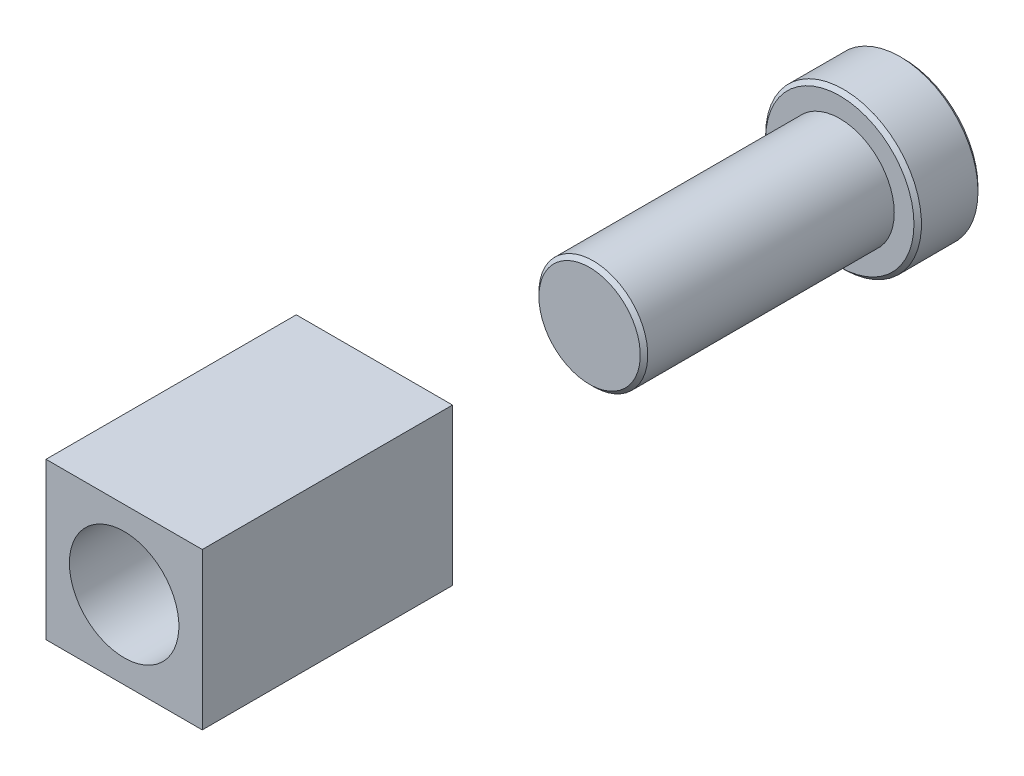
ISO-10303-21;
HEADER;
FILE_DESCRIPTION(('STEP AP214'),'2;1');
FILE_NAME('part.step','',(''),(''),'','','');
FILE_SCHEMA(('AUTOMOTIVE_DESIGN { 1 0 10303 214 1 1 1 1 }'));
ENDSEC;
DATA;
#1=APPLICATION_CONTEXT('core data for automotive mechanical design processes');
#2=APPLICATION_PROTOCOL_DEFINITION('international standard','automotive_design',2000,#1);
#3=PRODUCT_CONTEXT('',#1,'mechanical');
#4=PRODUCT('Part','Part','',(#3));
#5=PRODUCT_RELATED_PRODUCT_CATEGORY('part','',(#4));
#6=PRODUCT_DEFINITION_FORMATION('','',#4);
#7=PRODUCT_DEFINITION_CONTEXT('part definition',#1,'design');
#8=PRODUCT_DEFINITION('design','',#6,#7);
#9=PRODUCT_DEFINITION_SHAPE('','',#8);
#10=(LENGTH_UNIT() NAMED_UNIT(*) SI_UNIT(.MILLI.,.METRE.));
#11=(NAMED_UNIT(*) PLANE_ANGLE_UNIT() SI_UNIT($,.RADIAN.));
#12=(NAMED_UNIT(*) SI_UNIT($,.STERADIAN.) SOLID_ANGLE_UNIT());
#13=UNCERTAINTY_MEASURE_WITH_UNIT(LENGTH_MEASURE(1.E-05),#10,'distance_accuracy_value','');
#14=(GEOMETRIC_REPRESENTATION_CONTEXT(3) GLOBAL_UNCERTAINTY_ASSIGNED_CONTEXT((#13)) GLOBAL_UNIT_ASSIGNED_CONTEXT((#10,
#11,#12)) REPRESENTATION_CONTEXT('',''));
#15=CARTESIAN_POINT('',(0.,0.,0.));
#16=DIRECTION('',(0.,0.,1.));
#17=DIRECTION('',(1.,0.,0.));
#18=AXIS2_PLACEMENT_3D('',#15,#16,#17);
#19=CARTESIAN_POINT('',(-15.8613491960392,15.8613491960392,158.283276511442));
#20=DIRECTION('',(1.,0.,0.));
#21=DIRECTION('',(0.,1.,0.));
#22=AXIS2_PLACEMENT_3D('',#19,#20,#21);
#23=PLANE('',#22);
#24=DIRECTION('',(0.,-1.,0.));
#25=VECTOR('',#24,1.);
#26=CARTESIAN_POINT('',(-15.8613491960392,15.8613491960392,107.483276511442));
#27=LINE('',#26,#25);
#28=CARTESIAN_POINT('',(-15.8613491960392,15.8613491960392,107.483276511442));
#29=VERTEX_POINT('',#28);
#30=CARTESIAN_POINT('',(-15.8613491960392,-15.8613491960392,107.483276511442));
#31=VERTEX_POINT('',#30);
#32=EDGE_CURVE('E108',#29,#31,#27,.T.);
#33=ORIENTED_EDGE('',*,*,#32,.T.);
#34=DIRECTION('',(0.,0.,-1.));
#35=VECTOR('',#34,1.);
#36=CARTESIAN_POINT('',(-15.8613491960392,-15.8613491960392,158.283276511442));
#37=LINE('',#36,#35);
#38=CARTESIAN_POINT('',(-15.8613491960392,-15.8613491960392,158.283276511442));
#39=VERTEX_POINT('',#38);
#40=EDGE_CURVE('E12',#39,#31,#37,.T.);
#41=ORIENTED_EDGE('',*,*,#40,.F.);
#42=DIRECTION('',(0.,-1.,0.));
#43=VECTOR('',#42,1.);
#44=CARTESIAN_POINT('',(-15.8613491960392,15.8613491960392,158.283276511442));
#45=LINE('',#44,#43);
#46=CARTESIAN_POINT('',(-15.8613491960392,15.8613491960392,158.283276511442));
#47=VERTEX_POINT('',#46);
#48=EDGE_CURVE('E96',#47,#39,#45,.T.);
#49=ORIENTED_EDGE('',*,*,#48,.F.);
#50=DIRECTION('',(0.,0.,-1.));
#51=VECTOR('',#50,1.);
#52=CARTESIAN_POINT('',(-15.8613491960392,15.8613491960392,158.283276511442));
#53=LINE('',#52,#51);
#54=EDGE_CURVE('E104',#47,#29,#53,.T.);
#55=ORIENTED_EDGE('',*,*,#54,.T.);
#56=EDGE_LOOP('',(#33,#41,#49,#55));
#57=FACE_BOUND('',#56,.T.);
#58=ADVANCED_FACE('F45',(#57),#23,.F.);
#59=CARTESIAN_POINT('',(-15.8613491960392,-15.8613491960392,158.283276511442));
#60=DIRECTION('',(0.,1.,0.));
#61=DIRECTION('',(0.,0.,1.));
#62=AXIS2_PLACEMENT_3D('',#59,#60,#61);
#63=PLANE('',#62);
#64=DIRECTION('',(1.,0.,0.));
#65=VECTOR('',#64,1.);
#66=CARTESIAN_POINT('',(-15.8613491960392,-15.8613491960392,107.483276511442));
#67=LINE('',#66,#65);
#68=CARTESIAN_POINT('',(15.8613491960392,-15.8613491960392,107.483276511442));
#69=VERTEX_POINT('',#68);
#70=EDGE_CURVE('E100',#31,#69,#67,.T.);
#71=ORIENTED_EDGE('',*,*,#70,.T.);
#72=DIRECTION('',(0.,0.,-1.));
#73=VECTOR('',#72,1.);
#74=CARTESIAN_POINT('',(15.8613491960392,-15.8613491960392,158.283276511442));
#75=LINE('',#74,#73);
#76=CARTESIAN_POINT('',(15.8613491960392,-15.8613491960392,158.283276511442));
#77=VERTEX_POINT('',#76);
#78=EDGE_CURVE('E53',#77,#69,#75,.T.);
#79=ORIENTED_EDGE('',*,*,#78,.F.);
#80=DIRECTION('',(1.,0.,0.));
#81=VECTOR('',#80,1.);
#82=CARTESIAN_POINT('',(-15.8613491960392,-15.8613491960392,158.283276511442));
#83=LINE('',#82,#81);
#84=EDGE_CURVE('E91',#39,#77,#83,.T.);
#85=ORIENTED_EDGE('',*,*,#84,.F.);
#86=ORIENTED_EDGE('',*,*,#40,.T.);
#87=EDGE_LOOP('',(#71,#79,#85,#86));
#88=FACE_BOUND('',#87,.T.);
#89=ADVANCED_FACE('F99',(#88),#63,.F.);
#90=CARTESIAN_POINT('',(15.8613491960392,15.8613491960392,158.283276511442));
#91=DIRECTION('',(-1.,0.,0.));
#92=DIRECTION('',(0.,-1.,0.));
#93=AXIS2_PLACEMENT_3D('',#90,#91,#92);
#94=PLANE('',#93);
#95=DIRECTION('',(0.,1.,0.));
#96=VECTOR('',#95,1.);
#97=CARTESIAN_POINT('',(15.8613491960392,15.8613491960392,107.483276511442));
#98=LINE('',#97,#96);
#99=CARTESIAN_POINT('',(15.8613491960392,15.8613491960392,107.483276511442));
#100=VERTEX_POINT('',#99);
#101=EDGE_CURVE('E78',#69,#100,#98,.T.);
#102=ORIENTED_EDGE('',*,*,#101,.T.);
#103=DIRECTION('',(0.,0.,-1.));
#104=VECTOR('',#103,1.);
#105=CARTESIAN_POINT('',(15.8613491960392,15.8613491960392,158.283276511442));
#106=LINE('',#105,#104);
#107=CARTESIAN_POINT('',(15.8613491960392,15.8613491960392,158.283276511442));
#108=VERTEX_POINT('',#107);
#109=EDGE_CURVE('E101',#108,#100,#106,.T.);
#110=ORIENTED_EDGE('',*,*,#109,.F.);
#111=DIRECTION('',(0.,1.,0.));
#112=VECTOR('',#111,1.);
#113=CARTESIAN_POINT('',(15.8613491960392,15.8613491960392,158.283276511442));
#114=LINE('',#113,#112);
#115=EDGE_CURVE('E94',#77,#108,#114,.T.);
#116=ORIENTED_EDGE('',*,*,#115,.F.);
#117=ORIENTED_EDGE('',*,*,#78,.T.);
#118=EDGE_LOOP('',(#102,#110,#116,#117));
#119=FACE_BOUND('',#118,.T.);
#120=ADVANCED_FACE('F102',(#119),#94,.F.);
#121=CARTESIAN_POINT('',(-15.8613491960392,15.8613491960392,158.283276511442));
#122=DIRECTION('',(0.,-1.,0.));
#123=DIRECTION('',(0.,0.,-1.));
#124=AXIS2_PLACEMENT_3D('',#121,#122,#123);
#125=PLANE('',#124);
#126=DIRECTION('',(-1.,0.,0.));
#127=VECTOR('',#126,1.);
#128=CARTESIAN_POINT('',(-15.8613491960392,15.8613491960392,107.483276511442));
#129=LINE('',#128,#127);
#130=EDGE_CURVE('E84',#100,#29,#129,.T.);
#131=ORIENTED_EDGE('',*,*,#130,.T.);
#132=ORIENTED_EDGE('',*,*,#54,.F.);
#133=DIRECTION('',(-1.,0.,0.));
#134=VECTOR('',#133,1.);
#135=CARTESIAN_POINT('',(-15.8613491960392,15.8613491960392,158.283276511442));
#136=LINE('',#135,#134);
#137=EDGE_CURVE('E61',#108,#47,#136,.T.);
#138=ORIENTED_EDGE('',*,*,#137,.F.);
#139=ORIENTED_EDGE('',*,*,#109,.T.);
#140=EDGE_LOOP('',(#131,#132,#138,#139));
#141=FACE_BOUND('',#140,.T.);
#142=ADVANCED_FACE('F116',(#141),#125,.F.);
#143=CARTESIAN_POINT('',(0.,0.,158.283276511442));
#144=DIRECTION('',(0.,0.,1.));
#145=DIRECTION('',(1.,0.,0.));
#146=AXIS2_PLACEMENT_3D('',#143,#144,#145);
#147=PLANE('',#146);
#148=CARTESIAN_POINT('',(0.,0.,158.283276511442));
#149=DIRECTION('',(0.,0.,-1.));
#150=DIRECTION('',(-1.,0.,0.));
#151=AXIS2_PLACEMENT_3D('',#148,#149,#150);
#152=CIRCLE('',#151,11.1125);
#153=CARTESIAN_POINT('',(-11.1125,0.,158.283276511442));
#154=VERTEX_POINT('',#153);
#155=EDGE_CURVE('E111',#154,#154,#152,.T.);
#156=ORIENTED_EDGE('',*,*,#155,.T.);
#157=EDGE_LOOP('',(#156));
#158=FACE_BOUND('',#157,.T.);
#159=ORIENTED_EDGE('',*,*,#48,.T.);
#160=ORIENTED_EDGE('',*,*,#84,.T.);
#161=ORIENTED_EDGE('',*,*,#115,.T.);
#162=ORIENTED_EDGE('',*,*,#137,.T.);
#163=EDGE_LOOP('',(#159,#160,#161,#162));
#164=FACE_BOUND('',#163,.T.);
#165=ADVANCED_FACE('F92',(#158,#164),#147,.T.);
#166=CARTESIAN_POINT('',(0.,0.,107.483276511442));
#167=DIRECTION('',(0.,0.,1.));
#168=DIRECTION('',(1.,0.,0.));
#169=AXIS2_PLACEMENT_3D('',#166,#167,#168);
#170=PLANE('',#169);
#171=CARTESIAN_POINT('',(0.,0.,107.483276511442));
#172=DIRECTION('',(0.,0.,-1.));
#173=DIRECTION('',(-1.,0.,0.));
#174=AXIS2_PLACEMENT_3D('',#171,#172,#173);
#175=CIRCLE('',#174,11.1125);
#176=CARTESIAN_POINT('',(-11.1125,0.,107.483276511442));
#177=VERTEX_POINT('',#176);
#178=EDGE_CURVE('E122',#177,#177,#175,.T.);
#179=ORIENTED_EDGE('',*,*,#178,.F.);
#180=EDGE_LOOP('',(#179));
#181=FACE_BOUND('',#180,.T.);
#182=ORIENTED_EDGE('',*,*,#32,.F.);
#183=ORIENTED_EDGE('',*,*,#130,.F.);
#184=ORIENTED_EDGE('',*,*,#101,.F.);
#185=ORIENTED_EDGE('',*,*,#70,.F.);
#186=EDGE_LOOP('',(#182,#183,#184,#185));
#187=FACE_BOUND('',#186,.T.);
#188=ADVANCED_FACE('F119',(#181,#187),#170,.F.);
#189=CARTESIAN_POINT('',(0.,0.,158.283276511442));
#190=DIRECTION('',(0.,0.,-1.));
#191=DIRECTION('',(-1.,0.,0.));
#192=AXIS2_PLACEMENT_3D('',#189,#190,#191);
#193=CYLINDRICAL_SURFACE('',#192,11.1125);
#194=ORIENTED_EDGE('',*,*,#155,.F.);
#195=EDGE_LOOP('',(#194));
#196=FACE_BOUND('',#195,.T.);
#197=ORIENTED_EDGE('',*,*,#178,.T.);
#198=EDGE_LOOP('',(#197));
#199=FACE_BOUND('',#198,.T.);
#200=ADVANCED_FACE('F129',(#196,#199),#193,.F.);
#201=CLOSED_SHELL('',(#58,#89,#120,#142,#165,#188,#200));
#202=MANIFOLD_SOLID_BREP('B2',#201);
#203=CARTESIAN_POINT('',(0.,0.,12.9988235294118));
#204=DIRECTION('',(0.,0.,1.));
#205=DIRECTION('',(1.,0.,0.));
#206=AXIS2_PLACEMENT_3D('',#203,#204,#205);
#207=PLANE('',#206);
#208=CARTESIAN_POINT('',(0.,0.,12.9988235294118));
#209=DIRECTION('',(0.,0.,1.));
#210=DIRECTION('',(1.,0.,0.));
#211=AXIS2_PLACEMENT_3D('',#208,#209,#210);
#212=CIRCLE('',#211,15.0495000000001);
#213=CARTESIAN_POINT('',(15.0495000000001,0.,12.9988235294118));
#214=VERTEX_POINT('',#213);
#215=EDGE_CURVE('E201',#214,#214,#212,.T.);
#216=ORIENTED_EDGE('',*,*,#215,.T.);
#217=EDGE_LOOP('',(#216));
#218=FACE_BOUND('',#217,.T.);
#219=CARTESIAN_POINT('',(0.,0.,12.9988235294118));
#220=DIRECTION('',(0.,0.,1.));
#221=DIRECTION('',(1.,0.,0.));
#222=AXIS2_PLACEMENT_3D('',#219,#220,#221);
#223=CIRCLE('',#222,11.049);
#224=CARTESIAN_POINT('',(11.049,0.,12.9988235294118));
#225=VERTEX_POINT('',#224);
#226=EDGE_CURVE('E216',#225,#225,#223,.T.);
#227=ORIENTED_EDGE('',*,*,#226,.F.);
#228=EDGE_LOOP('',(#227));
#229=FACE_BOUND('',#228,.T.);
#230=ADVANCED_FACE('F190',(#218,#229),#207,.T.);
#231=CARTESIAN_POINT('',(0.,0.,12.9988235294118));
#232=DIRECTION('',(0.,0.,-1.));
#233=DIRECTION('',(-1.,0.,0.));
#234=AXIS2_PLACEMENT_3D('',#231,#232,#233);
#235=CYLINDRICAL_SURFACE('',#234,15.8115);
#236=CARTESIAN_POINT('',(0.,0.,0.762000000000034));
#237=DIRECTION('',(0.,0.,1.));
#238=DIRECTION('',(1.,0.,0.));
#239=AXIS2_PLACEMENT_3D('',#236,#237,#238);
#240=CIRCLE('',#239,15.8115);
#241=CARTESIAN_POINT('',(-15.8115,0.,0.762000000000032));
#242=VERTEX_POINT('',#241);
#243=EDGE_CURVE('E210',#242,#242,#240,.T.);
#244=CARTESIAN_POINT('',(0.,0.,12.2368235294118));
#245=DIRECTION('',(0.,0.,1.));
#246=DIRECTION('',(1.,0.,0.));
#247=AXIS2_PLACEMENT_3D('',#244,#245,#246);
#248=CIRCLE('',#247,15.8115);
#249=CARTESIAN_POINT('',(-15.8115,0.,12.2368235294118));
#250=VERTEX_POINT('',#249);
#251=EDGE_CURVE('E213',#250,#250,#248,.F.);
#252=CARTESIAN_POINT('',(-15.8115,0.,0.762000000000032));
#253=CARTESIAN_POINT('',(-15.8115,0.,0.881529411764738));
#254=CARTESIAN_POINT('',(-15.8115,0.,1.00105882352944));
#255=CARTESIAN_POINT('',(-15.8115,0.,1.24011764705886));
#256=CARTESIAN_POINT('',(-15.8115,0.,1.35964705882356));
#257=CARTESIAN_POINT('',(-15.8115,0.,1.59870588235297));
#258=CARTESIAN_POINT('',(-15.8115,0.,1.71823529411768));
#259=CARTESIAN_POINT('',(-15.8115,0.,1.95729411764709));
#260=CARTESIAN_POINT('',(-15.8115,0.,2.0768235294118));
#261=CARTESIAN_POINT('',(-15.8115,0.,2.31588235294121));
#262=CARTESIAN_POINT('',(-15.8115,0.,2.43541176470592));
#263=CARTESIAN_POINT('',(-15.8115,0.,2.67447058823533));
#264=CARTESIAN_POINT('',(-15.8115,0.,2.79400000000004));
#265=CARTESIAN_POINT('',(-15.8115,0.,3.03305882352945));
#266=CARTESIAN_POINT('',(-15.8115,0.,3.15258823529415));
#267=CARTESIAN_POINT('',(-15.8115,0.,3.39164705882357));
#268=CARTESIAN_POINT('',(-15.8115,0.,3.51117647058827));
#269=CARTESIAN_POINT('',(-15.8115,0.,3.75023529411768));
#270=CARTESIAN_POINT('',(-15.8115,0.,3.86976470588239));
#271=CARTESIAN_POINT('',(-15.8115,0.,4.1088235294118));
#272=CARTESIAN_POINT('',(-15.8115,0.,4.22835294117651));
#273=CARTESIAN_POINT('',(-15.8115,0.,4.46741176470592));
#274=CARTESIAN_POINT('',(-15.8115,0.,4.58694117647063));
#275=CARTESIAN_POINT('',(-15.8115,0.,4.82600000000004));
#276=CARTESIAN_POINT('',(-15.8115,0.,4.94552941176475));
#277=CARTESIAN_POINT('',(-15.8115,0.,5.18458823529416));
#278=CARTESIAN_POINT('',(-15.8115,0.,5.30411764705886));
#279=CARTESIAN_POINT('',(-15.8115,0.,5.54317647058827));
#280=CARTESIAN_POINT('',(-15.8115,0.,5.66270588235298));
#281=CARTESIAN_POINT('',(-15.8115,0.,5.90176470588239));
#282=CARTESIAN_POINT('',(-15.8115,0.,6.0212941176471));
#283=CARTESIAN_POINT('',(-15.8115,0.,6.26035294117651));
#284=CARTESIAN_POINT('',(-15.8115,0.,6.37988235294122));
#285=CARTESIAN_POINT('',(-15.8115,0.,6.61894117647063));
#286=CARTESIAN_POINT('',(-15.8115,0.,6.73847058823534));
#287=CARTESIAN_POINT('',(-15.8115,0.,6.97752941176475));
#288=CARTESIAN_POINT('',(-15.8115,0.,7.09705882352945));
#289=CARTESIAN_POINT('',(-15.8115,0.,7.33611764705887));
#290=CARTESIAN_POINT('',(-15.8115,0.,7.45564705882357));
#291=CARTESIAN_POINT('',(-15.8115,0.,7.69470588235298));
#292=CARTESIAN_POINT('',(-15.8115,0.,7.81423529411769));
#293=CARTESIAN_POINT('',(-15.8115,0.,8.0532941176471));
#294=CARTESIAN_POINT('',(-15.8115,0.,8.17282352941181));
#295=CARTESIAN_POINT('',(-15.8115,0.,8.41188235294122));
#296=CARTESIAN_POINT('',(-15.8115,0.,8.53141176470593));
#297=CARTESIAN_POINT('',(-15.8115,0.,8.77047058823534));
#298=CARTESIAN_POINT('',(-15.8115,0.,8.89000000000004));
#299=CARTESIAN_POINT('',(-15.8115,0.,9.12905882352946));
#300=CARTESIAN_POINT('',(-15.8115,0.,9.24858823529416));
#301=CARTESIAN_POINT('',(-15.8115,0.,9.48764705882357));
#302=CARTESIAN_POINT('',(-15.8115,0.,9.60717647058828));
#303=CARTESIAN_POINT('',(-15.8115,0.,9.84623529411769));
#304=CARTESIAN_POINT('',(-15.8115,0.,9.9657647058824));
#305=CARTESIAN_POINT('',(-15.8115,0.,10.2048235294118));
#306=CARTESIAN_POINT('',(-15.8115,0.,10.3243529411765));
#307=CARTESIAN_POINT('',(-15.8115,0.,10.5634117647059));
#308=CARTESIAN_POINT('',(-15.8115,0.,10.6829411764706));
#309=CARTESIAN_POINT('',(-15.8115,0.,10.922));
#310=CARTESIAN_POINT('',(-15.8115,0.,11.0415294117648));
#311=CARTESIAN_POINT('',(-15.8115,0.,11.2805882352942));
#312=CARTESIAN_POINT('',(-15.8115,0.,11.4001176470589));
#313=CARTESIAN_POINT('',(-15.8115,0.,11.6391764705883));
#314=CARTESIAN_POINT('',(-15.8115,0.,11.758705882353));
#315=CARTESIAN_POINT('',(-15.8115,0.,11.9977647058824));
#316=CARTESIAN_POINT('',(-15.8115,0.,12.1172941176471));
#317=CARTESIAN_POINT('',(-15.8115,0.,12.2368235294118));
#318=B_SPLINE_CURVE_WITH_KNOTS('',3,(#252,#253,#254,#255,#256,#257,#258,#259,#260,#261,#262,
#263,#264,#265,#266,#267,#268,#269,#270,#271,#272,#273,#274,#275,#276,#277,#278,#279,#280,#281,
#282,#283,#284,#285,#286,#287,#288,#289,#290,#291,#292,#293,#294,#295,#296,#297,#298,#299,#300,
#301,#302,#303,#304,#305,#306,#307,#308,#309,#310,#311,#312,#313,#314,#315,#316,#317),
.UNSPECIFIED.,.F.,.F.,(4,2,2,2,2,2,2,2,2,2,2,2,2,2,2,2,2,2,2,2,2,2,2,2,2,2,2,2,2,2,2,2,4),(0.,
0.358588235294117,0.717176470588237,1.07576470588235,1.43435294117647,1.79294117647059,
2.15152941176471,2.51011764705883,2.86870588235295,3.22729411764706,3.58588235294118,
3.9444705882353,4.30305882352942,4.66164705882354,5.02023529411766,5.37882352941177,
5.73741176470589,6.09600000000001,6.45458823529413,6.81317647058825,7.17176470588237,
7.53035294117648,7.8889411764706,8.24752941176472,8.60611764705884,8.96470588235296,
9.32329411764707,9.68188235294119,10.0404705882353,10.3990588235294,10.7576470588235,
11.1162352941177,11.4748235294118),.UNSPECIFIED.);
#319=EDGE_CURVE('BSEAM223',#242,#250,#318,.T.);
#320=ORIENTED_EDGE('',*,*,#243,.T.);
#321=ORIENTED_EDGE('',*,*,#251,.T.);
#322=ORIENTED_EDGE('',*,*,#319,.T.);
#323=ORIENTED_EDGE('',*,*,#319,.F.);
#324=EDGE_LOOP('',(#320,#322,#321,#323));
#325=FACE_BOUND('',#324,.T.);
#326=ADVANCED_FACE('F223',(#325),#235,.T.);
#327=CARTESIAN_POINT('',(0.,0.,0.));
#328=DIRECTION('',(0.,0.,1.));
#329=DIRECTION('',(1.,0.,0.));
#330=AXIS2_PLACEMENT_3D('',#327,#328,#329);
#331=PLANE('',#330);
#332=CARTESIAN_POINT('',(0.,0.,0.));
#333=DIRECTION('',(0.,0.,1.));
#334=DIRECTION('',(1.,0.,0.));
#335=AXIS2_PLACEMENT_3D('',#332,#333,#334);
#336=CIRCLE('',#335,15.0495);
#337=CARTESIAN_POINT('',(15.0495,0.,0.));
#338=VERTEX_POINT('',#337);
#339=EDGE_CURVE('E205',#338,#338,#336,.F.);
#340=ORIENTED_EDGE('',*,*,#339,.T.);
#341=EDGE_LOOP('',(#340));
#342=FACE_BOUND('',#341,.T.);
#343=ADVANCED_FACE('F229',(#342),#331,.F.);
#344=CARTESIAN_POINT('',(0.,0.,63.7988235294118));
#345=DIRECTION('',(0.,0.,-1.));
#346=DIRECTION('',(-1.,0.,0.));
#347=AXIS2_PLACEMENT_3D('',#344,#345,#346);
#348=CYLINDRICAL_SURFACE('',#347,11.049);
#349=CARTESIAN_POINT('',(0.,0.,63.0368235294118));
#350=DIRECTION('',(0.,0.,1.));
#351=DIRECTION('',(1.,0.,0.));
#352=AXIS2_PLACEMENT_3D('',#349,#350,#351);
#353=CIRCLE('',#352,11.049);
#354=CARTESIAN_POINT('',(-11.049,0.,63.0368235294117));
#355=VERTEX_POINT('',#354);
#356=EDGE_CURVE('E44',#355,#355,#353,.F.);
#357=ORIENTED_EDGE('',*,*,#356,.T.);
#358=EDGE_LOOP('',(#357));
#359=FACE_BOUND('',#358,.T.);
#360=ORIENTED_EDGE('',*,*,#226,.T.);
#361=EDGE_LOOP('',(#360));
#362=FACE_BOUND('',#361,.T.);
#363=ADVANCED_FACE('F220',(#359,#362),#348,.T.);
#364=CARTESIAN_POINT('',(0.,0.,63.7988235294118));
#365=DIRECTION('',(0.,0.,1.));
#366=DIRECTION('',(1.,0.,0.));
#367=AXIS2_PLACEMENT_3D('',#364,#365,#366);
#368=PLANE('',#367);
#369=CARTESIAN_POINT('',(0.,0.,63.7988235294118));
#370=DIRECTION('',(0.,0.,1.));
#371=DIRECTION('',(1.,0.,0.));
#372=AXIS2_PLACEMENT_3D('',#369,#370,#371);
#373=CIRCLE('',#372,10.287);
#374=CARTESIAN_POINT('',(-10.287,0.,63.7988235294118));
#375=VERTEX_POINT('',#374);
#376=EDGE_CURVE('E197',#375,#375,#373,.T.);
#377=ORIENTED_EDGE('',*,*,#376,.T.);
#378=EDGE_LOOP('',(#377));
#379=FACE_BOUND('',#378,.T.);
#380=ADVANCED_FACE('F241',(#379),#368,.T.);
#381=CARTESIAN_POINT('',(0.,0.,0.762000000000034));
#382=DIRECTION('',(0.,0.,1.));
#383=DIRECTION('',(1.,0.,0.));
#384=AXIS2_PLACEMENT_3D('',#381,#382,#383);
#385=CONICAL_SURFACE('',#384,15.8115,0.785398163397453);
#386=ORIENTED_EDGE('',*,*,#339,.F.);
#387=EDGE_LOOP('',(#386));
#388=FACE_BOUND('',#387,.T.);
#389=ORIENTED_EDGE('',*,*,#243,.F.);
#390=EDGE_LOOP('',(#389));
#391=FACE_BOUND('',#390,.T.);
#392=ADVANCED_FACE('F238',(#388,#391),#385,.T.);
#393=CARTESIAN_POINT('',(0.,0.,12.9988235294118));
#394=DIRECTION('',(0.,0.,-1.));
#395=DIRECTION('',(-1.,0.,0.));
#396=AXIS2_PLACEMENT_3D('',#393,#394,#395);
#397=CONICAL_SURFACE('',#396,15.0495000000001,0.785398163397446);
#398=ORIENTED_EDGE('',*,*,#251,.F.);
#399=EDGE_LOOP('',(#398));
#400=FACE_BOUND('',#399,.T.);
#401=ORIENTED_EDGE('',*,*,#215,.F.);
#402=EDGE_LOOP('',(#401));
#403=FACE_BOUND('',#402,.T.);
#404=ADVANCED_FACE('F240',(#400,#403),#397,.T.);
#405=CARTESIAN_POINT('',(0.,0.,63.7988235294118));
#406=DIRECTION('',(0.,0.,-1.));
#407=DIRECTION('',(-1.,0.,0.));
#408=AXIS2_PLACEMENT_3D('',#405,#406,#407);
#409=CONICAL_SURFACE('',#408,10.287,0.785398163397446);
#410=CARTESIAN_POINT('',(-11.049,0.,63.0368235294117));
#411=CARTESIAN_POINT('',(-11.0410625,0.,63.0447610294118));
#412=CARTESIAN_POINT('',(-11.033125,0.,63.0526985294118));
#413=CARTESIAN_POINT('',(-11.01725,0.,63.0685735294118));
#414=CARTESIAN_POINT('',(-11.0093125,0.,63.0765110294118));
#415=CARTESIAN_POINT('',(-10.9934375,0.,63.0923860294117));
#416=CARTESIAN_POINT('',(-10.9855,0.,63.1003235294118));
#417=CARTESIAN_POINT('',(-10.969625,0.,63.1161985294117));
#418=CARTESIAN_POINT('',(-10.9616875,0.,63.1241360294118));
#419=CARTESIAN_POINT('',(-10.9458125,0.,63.1400110294117));
#420=CARTESIAN_POINT('',(-10.937875,0.,63.1479485294117));
#421=CARTESIAN_POINT('',(-10.922,0.,63.1638235294117));
#422=CARTESIAN_POINT('',(-10.9140625,0.,63.1717610294118));
#423=CARTESIAN_POINT('',(-10.8981875,0.,63.1876360294118));
#424=CARTESIAN_POINT('',(-10.89025,0.,63.1955735294118));
#425=CARTESIAN_POINT('',(-10.874375,0.,63.2114485294118));
#426=CARTESIAN_POINT('',(-10.8664375,0.,63.2193860294118));
#427=CARTESIAN_POINT('',(-10.8505625,0.,63.2352610294118));
#428=CARTESIAN_POINT('',(-10.842625,0.,63.2431985294117));
#429=CARTESIAN_POINT('',(-10.82675,0.,63.2590735294118));
#430=CARTESIAN_POINT('',(-10.8188125,0.,63.2670110294117));
#431=CARTESIAN_POINT('',(-10.8029375,0.,63.2828860294117));
#432=CARTESIAN_POINT('',(-10.795,0.,63.2908235294118));
#433=CARTESIAN_POINT('',(-10.779125,0.,63.3066985294118));
#434=CARTESIAN_POINT('',(-10.7711875,0.,63.3146360294118));
#435=CARTESIAN_POINT('',(-10.7553125,0.,63.3305110294118));
#436=CARTESIAN_POINT('',(-10.747375,0.,63.3384485294118));
#437=CARTESIAN_POINT('',(-10.7315,0.,63.3543235294118));
#438=CARTESIAN_POINT('',(-10.7235625,0.,63.3622610294118));
#439=CARTESIAN_POINT('',(-10.7076875,0.,63.3781360294117));
#440=CARTESIAN_POINT('',(-10.69975,0.,63.3860735294118));
#441=CARTESIAN_POINT('',(-10.683875,0.,63.4019485294117));
#442=CARTESIAN_POINT('',(-10.6759375,0.,63.4098860294118));
#443=CARTESIAN_POINT('',(-10.6600625,0.,63.4257610294117));
#444=CARTESIAN_POINT('',(-10.652125,0.,63.4336985294118));
#445=CARTESIAN_POINT('',(-10.63625,0.,63.4495735294118));
#446=CARTESIAN_POINT('',(-10.6283125,0.,63.4575110294118));
#447=CARTESIAN_POINT('',(-10.6124375,0.,63.4733860294118));
#448=CARTESIAN_POINT('',(-10.6045,0.,63.4813235294118));
#449=CARTESIAN_POINT('',(-10.588625,0.,63.4971985294118));
#450=CARTESIAN_POINT('',(-10.5806875,0.,63.5051360294118));
#451=CARTESIAN_POINT('',(-10.5648125,0.,63.5210110294118));
#452=CARTESIAN_POINT('',(-10.556875,0.,63.5289485294117));
#453=CARTESIAN_POINT('',(-10.541,0.,63.5448235294118));
#454=CARTESIAN_POINT('',(-10.5330625,0.,63.5527610294118));
#455=CARTESIAN_POINT('',(-10.5171875,0.,63.5686360294118));
#456=CARTESIAN_POINT('',(-10.50925,0.,63.5765735294118));
#457=CARTESIAN_POINT('',(-10.493375,0.,63.5924485294118));
#458=CARTESIAN_POINT('',(-10.4854375,0.,63.6003860294118));
#459=CARTESIAN_POINT('',(-10.4695625,0.,63.6162610294118));
#460=CARTESIAN_POINT('',(-10.461625,0.,63.6241985294118));
#461=CARTESIAN_POINT('',(-10.44575,0.,63.6400735294118));
#462=CARTESIAN_POINT('',(-10.4378125,0.,63.6480110294118));
#463=CARTESIAN_POINT('',(-10.4219375,0.,63.6638860294118));
#464=CARTESIAN_POINT('',(-10.414,0.,63.6718235294118));
#465=CARTESIAN_POINT('',(-10.398125,0.,63.6876985294118));
#466=CARTESIAN_POINT('',(-10.3901875,0.,63.6956360294118));
#467=CARTESIAN_POINT('',(-10.3743125,0.,63.7115110294118));
#468=CARTESIAN_POINT('',(-10.366375,0.,63.7194485294118));
#469=CARTESIAN_POINT('',(-10.3505,0.,63.7353235294118));
#470=CARTESIAN_POINT('',(-10.3425625,0.,63.7432610294118));
#471=CARTESIAN_POINT('',(-10.3266875,0.,63.7591360294118));
#472=CARTESIAN_POINT('',(-10.31875,0.,63.7670735294118));
#473=CARTESIAN_POINT('',(-10.302875,0.,63.7829485294118));
#474=CARTESIAN_POINT('',(-10.2949375,0.,63.7908860294118));
#475=CARTESIAN_POINT('',(-10.287,0.,63.7988235294118));
#476=B_SPLINE_CURVE_WITH_KNOTS('',3,(#410,#411,#412,#413,#414,#415,#416,#417,#418,#419,#420,
#421,#422,#423,#424,#425,#426,#427,#428,#429,#430,#431,#432,#433,#434,#435,#436,#437,#438,#439,
#440,#441,#442,#443,#444,#445,#446,#447,#448,#449,#450,#451,#452,#453,#454,#455,#456,#457,#458,
#459,#460,#461,#462,#463,#464,#465,#466,#467,#468,#469,#470,#471,#472,#473,#474,#475),
.UNSPECIFIED.,.F.,.F.,(4,2,2,2,2,2,2,2,2,2,2,2,2,2,2,2,2,2,2,2,2,2,2,2,2,2,2,2,2,2,2,2,4),(0.,
0.0336759604540172,0.0673519209080259,0.101027881362033,0.134703841816042,0.168379802270049,
0.202055762724067,0.235731723178075,0.269407683632083,0.303083644086091,0.336759604540099,
0.370435564994117,0.404111525448125,0.437787485902133,0.471463446356141,0.50513940681015,
0.538815367264157,0.572491327718174,0.606167288172183,0.63984324862619,0.673519209080199,
0.707195169534206,0.740871129988225,0.774547090442232,0.80822305089624,0.841899011350248,
0.875574971804256,0.909250932258274,0.942926892712281,0.97660285316629,1.0102788136203,
1.04395477407431,1.07763073452832),.UNSPECIFIED.);
#477=EDGE_CURVE('BSEAM192',#355,#375,#476,.T.);
#478=ORIENTED_EDGE('',*,*,#356,.F.);
#479=ORIENTED_EDGE('',*,*,#376,.F.);
#480=ORIENTED_EDGE('',*,*,#477,.T.);
#481=ORIENTED_EDGE('',*,*,#477,.F.);
#482=EDGE_LOOP('',(#478,#480,#479,#481));
#483=FACE_BOUND('',#482,.T.);
#484=ADVANCED_FACE('F192',(#483),#409,.T.);
#485=CLOSED_SHELL('',(#230,#326,#343,#363,#380,#392,#404,#484));
#486=MANIFOLD_SOLID_BREP('B6',#485);
#487=ADVANCED_BREP_SHAPE_REPRESENTATION('',(#18,#202,#486),#14);
#488=SHAPE_DEFINITION_REPRESENTATION(#9,#487);
ENDSEC;
END-ISO-10303-21;
